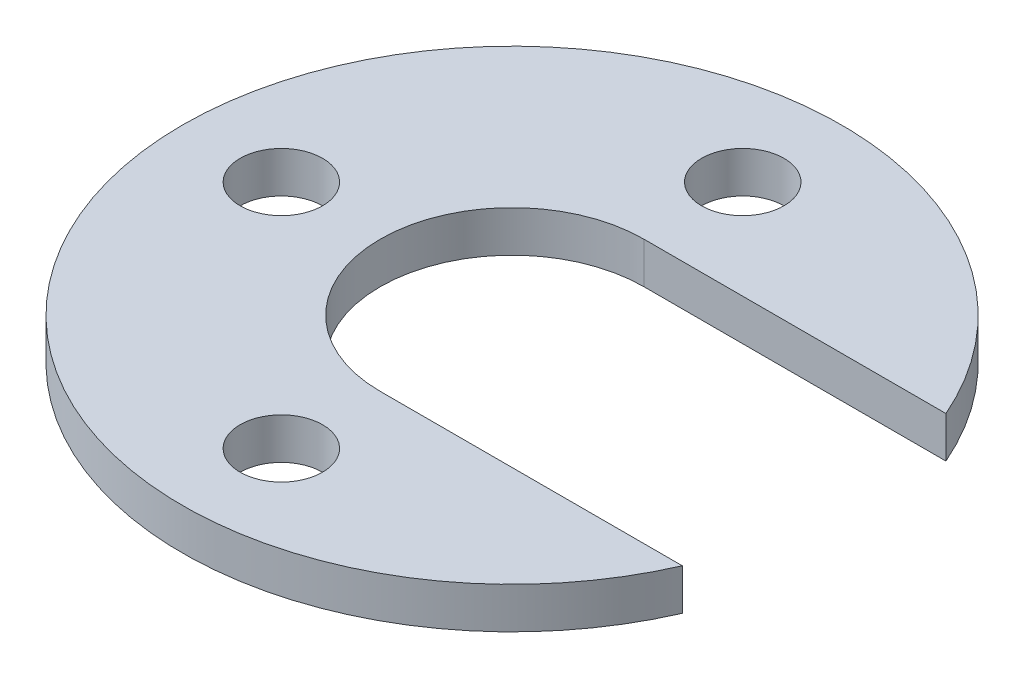
ISO-10303-21;
HEADER;
FILE_DESCRIPTION(('STEP AP214'),'2;1');
FILE_NAME('part.step','',(''),(''),'','','');
FILE_SCHEMA(('AUTOMOTIVE_DESIGN { 1 0 10303 214 1 1 1 1 }'));
ENDSEC;
DATA;
#1=APPLICATION_CONTEXT('core data for automotive mechanical design processes');
#2=APPLICATION_PROTOCOL_DEFINITION('international standard','automotive_design',2000,#1);
#3=PRODUCT_CONTEXT('',#1,'mechanical');
#4=PRODUCT('Part','Part','',(#3));
#5=PRODUCT_RELATED_PRODUCT_CATEGORY('part','',(#4));
#6=PRODUCT_DEFINITION_FORMATION('','',#4);
#7=PRODUCT_DEFINITION_CONTEXT('part definition',#1,'design');
#8=PRODUCT_DEFINITION('design','',#6,#7);
#9=PRODUCT_DEFINITION_SHAPE('','',#8);
#10=(LENGTH_UNIT() NAMED_UNIT(*) SI_UNIT(.MILLI.,.METRE.));
#11=(NAMED_UNIT(*) PLANE_ANGLE_UNIT() SI_UNIT($,.RADIAN.));
#12=(NAMED_UNIT(*) SI_UNIT($,.STERADIAN.) SOLID_ANGLE_UNIT());
#13=UNCERTAINTY_MEASURE_WITH_UNIT(LENGTH_MEASURE(1.E-05),#10,'distance_accuracy_value','');
#14=(GEOMETRIC_REPRESENTATION_CONTEXT(3) GLOBAL_UNCERTAINTY_ASSIGNED_CONTEXT((#13)) GLOBAL_UNIT_ASSIGNED_CONTEXT((#10,
#11,#12)) REPRESENTATION_CONTEXT('',''));
#15=CARTESIAN_POINT('',(0.,0.,0.));
#16=DIRECTION('',(0.,0.,1.));
#17=DIRECTION('',(1.,0.,0.));
#18=AXIS2_PLACEMENT_3D('',#15,#16,#17);
#19=CARTESIAN_POINT('',(0.,5.,0.));
#20=DIRECTION('',(0.,-1.,0.));
#21=DIRECTION('',(0.,0.,-1.));
#22=AXIS2_PLACEMENT_3D('',#19,#20,#21);
#23=PLANE('',#22);
#24=CARTESIAN_POINT('',(0.,5.,0.));
#25=DIRECTION('',(0.,-1.,0.));
#26=DIRECTION('',(0.,0.,-1.));
#27=AXIS2_PLACEMENT_3D('',#24,#25,#26);
#28=CIRCLE('',#27,16.);
#29=CARTESIAN_POINT('',(0.,5.,16.));
#30=VERTEX_POINT('',#29);
#31=CARTESIAN_POINT('',(0.,5.,-16.));
#32=VERTEX_POINT('',#31);
#33=EDGE_CURVE('E87',#30,#32,#28,.T.);
#34=ORIENTED_EDGE('',*,*,#33,.T.);
#35=DIRECTION('',(1.,0.,0.));
#36=VECTOR('',#35,1.);
#37=CARTESIAN_POINT('',(0.,5.,-16.));
#38=LINE('',#37,#36);
#39=CARTESIAN_POINT('',(36.6606055596467,5.,-16.));
#40=VERTEX_POINT('',#39);
#41=EDGE_CURVE('E82',#32,#40,#38,.T.);
#42=ORIENTED_EDGE('',*,*,#41,.T.);
#43=CARTESIAN_POINT('',(0.,5.,0.));
#44=DIRECTION('',(0.,1.,0.));
#45=DIRECTION('',(0.,0.,1.));
#46=AXIS2_PLACEMENT_3D('',#43,#44,#45);
#47=CIRCLE('',#46,40.);
#48=CARTESIAN_POINT('',(36.6606055596467,5.,16.));
#49=VERTEX_POINT('',#48);
#50=EDGE_CURVE('E85',#40,#49,#47,.T.);
#51=ORIENTED_EDGE('',*,*,#50,.T.);
#52=DIRECTION('',(-1.,0.,0.));
#53=VECTOR('',#52,1.);
#54=CARTESIAN_POINT('',(0.,5.,16.));
#55=LINE('',#54,#53);
#56=EDGE_CURVE('E52',#49,#30,#55,.T.);
#57=ORIENTED_EDGE('',*,*,#56,.T.);
#58=EDGE_LOOP('',(#34,#42,#51,#57));
#59=FACE_BOUND('',#58,.T.);
#60=CARTESIAN_POINT('',(0.,5.,-28.));
#61=DIRECTION('',(0.,1.,0.));
#62=DIRECTION('',(0.,0.,1.));
#63=AXIS2_PLACEMENT_3D('',#60,#61,#62);
#64=CIRCLE('',#63,5.);
#65=CARTESIAN_POINT('',(0.,5.,-23.));
#66=VERTEX_POINT('',#65);
#67=EDGE_CURVE('E102',#66,#66,#64,.T.);
#68=ORIENTED_EDGE('',*,*,#67,.F.);
#69=EDGE_LOOP('',(#68));
#70=FACE_BOUND('',#69,.T.);
#71=CARTESIAN_POINT('',(0.,5.,28.));
#72=DIRECTION('',(0.,1.,0.));
#73=DIRECTION('',(0.,0.,-1.));
#74=AXIS2_PLACEMENT_3D('',#71,#72,#73);
#75=CIRCLE('',#74,5.);
#76=CARTESIAN_POINT('',(0.,5.,23.));
#77=VERTEX_POINT('',#76);
#78=EDGE_CURVE('E117',#77,#77,#75,.T.);
#79=ORIENTED_EDGE('',*,*,#78,.F.);
#80=EDGE_LOOP('',(#79));
#81=FACE_BOUND('',#80,.T.);
#82=CARTESIAN_POINT('',(-28.,5.,0.));
#83=DIRECTION('',(0.,1.,0.));
#84=DIRECTION('',(0.,0.,-1.));
#85=AXIS2_PLACEMENT_3D('',#82,#83,#84);
#86=CIRCLE('',#85,5.);
#87=CARTESIAN_POINT('',(-28.,5.,-5.));
#88=VERTEX_POINT('',#87);
#89=EDGE_CURVE('E123',#88,#88,#86,.T.);
#90=ORIENTED_EDGE('',*,*,#89,.F.);
#91=EDGE_LOOP('',(#90));
#92=FACE_BOUND('',#91,.T.);
#93=ADVANCED_FACE('F35',(#59,#70,#81,#92),#23,.F.);
#94=CARTESIAN_POINT('',(0.,0.,0.));
#95=DIRECTION('',(0.,-1.,0.));
#96=DIRECTION('',(0.,0.,-1.));
#97=AXIS2_PLACEMENT_3D('',#94,#95,#96);
#98=PLANE('',#97);
#99=CARTESIAN_POINT('',(0.,0.,28.));
#100=DIRECTION('',(0.,1.,0.));
#101=DIRECTION('',(0.,0.,-1.));
#102=AXIS2_PLACEMENT_3D('',#99,#100,#101);
#103=CIRCLE('',#102,5.);
#104=CARTESIAN_POINT('',(0.,0.,23.));
#105=VERTEX_POINT('',#104);
#106=EDGE_CURVE('E120',#105,#105,#103,.T.);
#107=ORIENTED_EDGE('',*,*,#106,.T.);
#108=EDGE_LOOP('',(#107));
#109=FACE_BOUND('',#108,.T.);
#110=CARTESIAN_POINT('',(0.,0.,0.));
#111=DIRECTION('',(0.,-1.,0.));
#112=DIRECTION('',(0.,0.,-1.));
#113=AXIS2_PLACEMENT_3D('',#110,#111,#112);
#114=CIRCLE('',#113,16.);
#115=CARTESIAN_POINT('',(0.,0.,16.));
#116=VERTEX_POINT('',#115);
#117=CARTESIAN_POINT('',(0.,0.,-16.));
#118=VERTEX_POINT('',#117);
#119=EDGE_CURVE('E99',#116,#118,#114,.T.);
#120=ORIENTED_EDGE('',*,*,#119,.F.);
#121=DIRECTION('',(-1.,0.,0.));
#122=VECTOR('',#121,1.);
#123=CARTESIAN_POINT('',(0.,0.,16.));
#124=LINE('',#123,#122);
#125=CARTESIAN_POINT('',(36.6606055596467,0.,16.));
#126=VERTEX_POINT('',#125);
#127=EDGE_CURVE('E75',#126,#116,#124,.T.);
#128=ORIENTED_EDGE('',*,*,#127,.F.);
#129=CARTESIAN_POINT('',(0.,0.,0.));
#130=DIRECTION('',(0.,1.,0.));
#131=DIRECTION('',(0.,0.,1.));
#132=AXIS2_PLACEMENT_3D('',#129,#130,#131);
#133=CIRCLE('',#132,40.);
#134=CARTESIAN_POINT('',(36.6606055596467,0.,-16.));
#135=VERTEX_POINT('',#134);
#136=EDGE_CURVE('E69',#135,#126,#133,.T.);
#137=ORIENTED_EDGE('',*,*,#136,.F.);
#138=DIRECTION('',(1.,0.,0.));
#139=VECTOR('',#138,1.);
#140=CARTESIAN_POINT('',(0.,0.,-16.));
#141=LINE('',#140,#139);
#142=EDGE_CURVE('E91',#118,#135,#141,.T.);
#143=ORIENTED_EDGE('',*,*,#142,.F.);
#144=EDGE_LOOP('',(#120,#128,#137,#143));
#145=FACE_BOUND('',#144,.T.);
#146=CARTESIAN_POINT('',(0.,0.,-28.));
#147=DIRECTION('',(0.,1.,0.));
#148=DIRECTION('',(0.,0.,1.));
#149=AXIS2_PLACEMENT_3D('',#146,#147,#148);
#150=CIRCLE('',#149,5.);
#151=CARTESIAN_POINT('',(0.,0.,-23.));
#152=VERTEX_POINT('',#151);
#153=EDGE_CURVE('E114',#152,#152,#150,.T.);
#154=ORIENTED_EDGE('',*,*,#153,.T.);
#155=EDGE_LOOP('',(#154));
#156=FACE_BOUND('',#155,.T.);
#157=CARTESIAN_POINT('',(-28.,0.,0.));
#158=DIRECTION('',(0.,1.,0.));
#159=DIRECTION('',(0.,0.,-1.));
#160=AXIS2_PLACEMENT_3D('',#157,#158,#159);
#161=CIRCLE('',#160,5.);
#162=CARTESIAN_POINT('',(-28.,0.,-5.));
#163=VERTEX_POINT('',#162);
#164=EDGE_CURVE('E126',#163,#163,#161,.T.);
#165=ORIENTED_EDGE('',*,*,#164,.T.);
#166=EDGE_LOOP('',(#165));
#167=FACE_BOUND('',#166,.T.);
#168=ADVANCED_FACE('F110',(#109,#145,#156,#167),#98,.T.);
#169=CARTESIAN_POINT('',(0.,5.,0.));
#170=DIRECTION('',(0.,-1.,0.));
#171=DIRECTION('',(0.,0.,-1.));
#172=AXIS2_PLACEMENT_3D('',#169,#170,#171);
#173=CYLINDRICAL_SURFACE('',#172,16.);
#174=ORIENTED_EDGE('',*,*,#119,.T.);
#175=DIRECTION('',(0.,-1.,0.));
#176=VECTOR('',#175,1.);
#177=CARTESIAN_POINT('',(0.,5.,-16.));
#178=LINE('',#177,#176);
#179=EDGE_CURVE('E11',#32,#118,#178,.T.);
#180=ORIENTED_EDGE('',*,*,#179,.F.);
#181=ORIENTED_EDGE('',*,*,#33,.F.);
#182=DIRECTION('',(0.,-1.,0.));
#183=VECTOR('',#182,1.);
#184=CARTESIAN_POINT('',(0.,5.,16.));
#185=LINE('',#184,#183);
#186=EDGE_CURVE('E95',#30,#116,#185,.T.);
#187=ORIENTED_EDGE('',*,*,#186,.T.);
#188=EDGE_LOOP('',(#174,#180,#181,#187));
#189=FACE_BOUND('',#188,.T.);
#190=ADVANCED_FACE('F37',(#189),#173,.F.);
#191=CARTESIAN_POINT('',(0.,5.,-16.));
#192=DIRECTION('',(0.,0.,-1.));
#193=DIRECTION('',(-1.,0.,0.));
#194=AXIS2_PLACEMENT_3D('',#191,#192,#193);
#195=PLANE('',#194);
#196=ORIENTED_EDGE('',*,*,#142,.T.);
#197=DIRECTION('',(0.,-1.,0.));
#198=VECTOR('',#197,1.);
#199=CARTESIAN_POINT('',(36.6606055596467,5.,-16.));
#200=LINE('',#199,#198);
#201=EDGE_CURVE('E44',#40,#135,#200,.T.);
#202=ORIENTED_EDGE('',*,*,#201,.F.);
#203=ORIENTED_EDGE('',*,*,#41,.F.);
#204=ORIENTED_EDGE('',*,*,#179,.T.);
#205=EDGE_LOOP('',(#196,#202,#203,#204));
#206=FACE_BOUND('',#205,.T.);
#207=ADVANCED_FACE('F90',(#206),#195,.F.);
#208=CARTESIAN_POINT('',(0.,5.,0.));
#209=DIRECTION('',(0.,-1.,0.));
#210=DIRECTION('',(0.,0.,-1.));
#211=AXIS2_PLACEMENT_3D('',#208,#209,#210);
#212=CYLINDRICAL_SURFACE('',#211,40.);
#213=ORIENTED_EDGE('',*,*,#136,.T.);
#214=DIRECTION('',(0.,-1.,0.));
#215=VECTOR('',#214,1.);
#216=CARTESIAN_POINT('',(36.6606055596467,5.,16.));
#217=LINE('',#216,#215);
#218=EDGE_CURVE('E92',#49,#126,#217,.T.);
#219=ORIENTED_EDGE('',*,*,#218,.F.);
#220=ORIENTED_EDGE('',*,*,#50,.F.);
#221=ORIENTED_EDGE('',*,*,#201,.T.);
#222=EDGE_LOOP('',(#213,#219,#220,#221));
#223=FACE_BOUND('',#222,.T.);
#224=ADVANCED_FACE('F93',(#223),#212,.T.);
#225=CARTESIAN_POINT('',(0.,5.,16.));
#226=DIRECTION('',(0.,0.,1.));
#227=DIRECTION('',(1.,0.,0.));
#228=AXIS2_PLACEMENT_3D('',#225,#226,#227);
#229=PLANE('',#228);
#230=ORIENTED_EDGE('',*,*,#127,.T.);
#231=ORIENTED_EDGE('',*,*,#186,.F.);
#232=ORIENTED_EDGE('',*,*,#56,.F.);
#233=ORIENTED_EDGE('',*,*,#218,.T.);
#234=EDGE_LOOP('',(#230,#231,#232,#233));
#235=FACE_BOUND('',#234,.T.);
#236=ADVANCED_FACE('F107',(#235),#229,.F.);
#237=CARTESIAN_POINT('',(0.,5.,-28.));
#238=DIRECTION('',(0.,-1.,0.));
#239=DIRECTION('',(0.,0.,-1.));
#240=AXIS2_PLACEMENT_3D('',#237,#238,#239);
#241=CYLINDRICAL_SURFACE('',#240,5.);
#242=ORIENTED_EDGE('',*,*,#67,.T.);
#243=EDGE_LOOP('',(#242));
#244=FACE_BOUND('',#243,.T.);
#245=ORIENTED_EDGE('',*,*,#153,.F.);
#246=EDGE_LOOP('',(#245));
#247=FACE_BOUND('',#246,.T.);
#248=ADVANCED_FACE('F143',(#244,#247),#241,.F.);
#249=CARTESIAN_POINT('',(0.,5.,28.));
#250=DIRECTION('',(0.,-1.,0.));
#251=DIRECTION('',(0.,0.,-1.));
#252=AXIS2_PLACEMENT_3D('',#249,#250,#251);
#253=CYLINDRICAL_SURFACE('',#252,5.);
#254=ORIENTED_EDGE('',*,*,#78,.T.);
#255=EDGE_LOOP('',(#254));
#256=FACE_BOUND('',#255,.T.);
#257=ORIENTED_EDGE('',*,*,#106,.F.);
#258=EDGE_LOOP('',(#257));
#259=FACE_BOUND('',#258,.T.);
#260=ADVANCED_FACE('F196',(#256,#259),#253,.F.);
#261=CARTESIAN_POINT('',(-28.,5.,0.));
#262=DIRECTION('',(0.,-1.,0.));
#263=DIRECTION('',(0.,0.,-1.));
#264=AXIS2_PLACEMENT_3D('',#261,#262,#263);
#265=CYLINDRICAL_SURFACE('',#264,5.);
#266=ORIENTED_EDGE('',*,*,#89,.T.);
#267=EDGE_LOOP('',(#266));
#268=FACE_BOUND('',#267,.T.);
#269=ORIENTED_EDGE('',*,*,#164,.F.);
#270=EDGE_LOOP('',(#269));
#271=FACE_BOUND('',#270,.T.);
#272=ADVANCED_FACE('F132',(#268,#271),#265,.F.);
#273=CLOSED_SHELL('',(#93,#168,#190,#207,#224,#236,#248,#260,#272));
#274=MANIFOLD_SOLID_BREP('B2',#273);
#275=ADVANCED_BREP_SHAPE_REPRESENTATION('',(#18,#274),#14);
#276=SHAPE_DEFINITION_REPRESENTATION(#9,#275);
ENDSEC;
END-ISO-10303-21;
